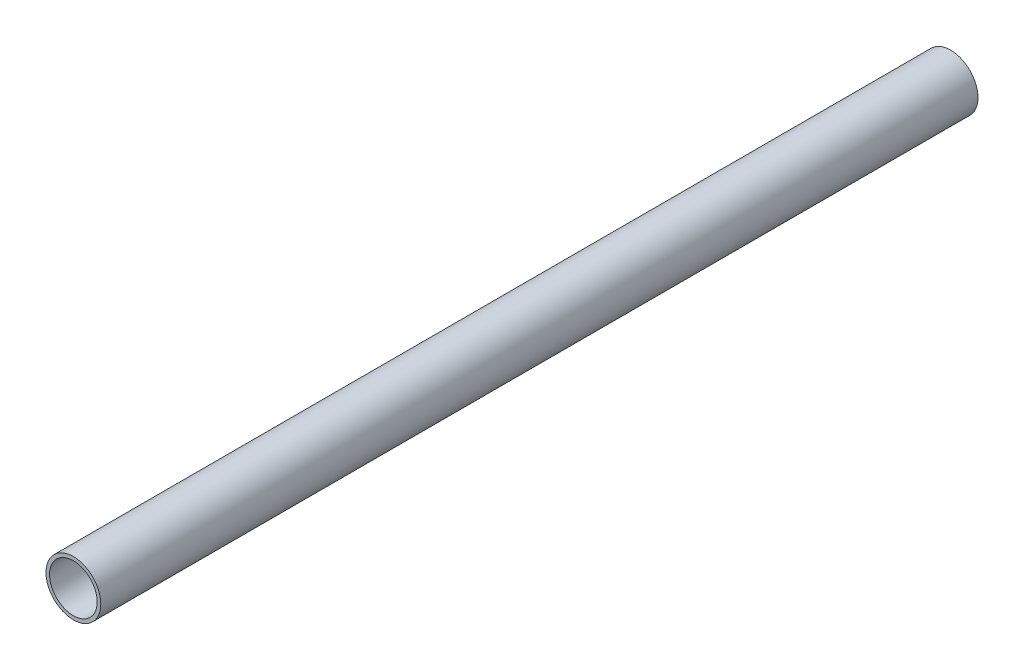
ISO-10303-21;
HEADER;
FILE_DESCRIPTION(('STEP AP214'),'2;1');
FILE_NAME('part.step','',(''),(''),'','','');
FILE_SCHEMA(('AUTOMOTIVE_DESIGN { 1 0 10303 214 1 1 1 1 }'));
ENDSEC;
DATA;
#1=APPLICATION_CONTEXT('core data for automotive mechanical design processes');
#2=APPLICATION_PROTOCOL_DEFINITION('international standard','automotive_design',2000,#1);
#3=PRODUCT_CONTEXT('',#1,'mechanical');
#4=PRODUCT('Part','Part','',(#3));
#5=PRODUCT_RELATED_PRODUCT_CATEGORY('part','',(#4));
#6=PRODUCT_DEFINITION_FORMATION('','',#4);
#7=PRODUCT_DEFINITION_CONTEXT('part definition',#1,'design');
#8=PRODUCT_DEFINITION('design','',#6,#7);
#9=PRODUCT_DEFINITION_SHAPE('','',#8);
#10=(LENGTH_UNIT() NAMED_UNIT(*) SI_UNIT(.MILLI.,.METRE.));
#11=(NAMED_UNIT(*) PLANE_ANGLE_UNIT() SI_UNIT($,.RADIAN.));
#12=(NAMED_UNIT(*) SI_UNIT($,.STERADIAN.) SOLID_ANGLE_UNIT());
#13=UNCERTAINTY_MEASURE_WITH_UNIT(LENGTH_MEASURE(1.E-05),#10,'distance_accuracy_value','');
#14=(GEOMETRIC_REPRESENTATION_CONTEXT(3) GLOBAL_UNCERTAINTY_ASSIGNED_CONTEXT((#13)) GLOBAL_UNIT_ASSIGNED_CONTEXT((#10,
#11,#12)) REPRESENTATION_CONTEXT('',''));
#15=CARTESIAN_POINT('',(0.,0.,0.));
#16=DIRECTION('',(0.,0.,1.));
#17=DIRECTION('',(1.,0.,0.));
#18=AXIS2_PLACEMENT_3D('',#15,#16,#17);
#19=CARTESIAN_POINT('',(0.,0.,152.4));
#20=DIRECTION('',(0.,0.,1.));
#21=DIRECTION('',(1.,0.,0.));
#22=AXIS2_PLACEMENT_3D('',#19,#20,#21);
#23=PLANE('',#22);
#24=CARTESIAN_POINT('',(0.,0.,152.4));
#25=DIRECTION('',(0.,0.,1.));
#26=DIRECTION('',(1.,0.,0.));
#27=AXIS2_PLACEMENT_3D('',#24,#25,#26);
#28=CIRCLE('',#27,9.525);
#29=CARTESIAN_POINT('',(9.525,0.,152.4));
#30=VERTEX_POINT('',#29);
#31=EDGE_CURVE('E10',#30,#30,#28,.T.);
#32=ORIENTED_EDGE('',*,*,#31,.T.);
#33=EDGE_LOOP('',(#32));
#34=FACE_BOUND('',#33,.T.);
#35=CARTESIAN_POINT('',(0.,0.,152.4));
#36=DIRECTION('',(0.,0.,1.));
#37=DIRECTION('',(1.,0.,0.));
#38=AXIS2_PLACEMENT_3D('',#35,#36,#37);
#39=CIRCLE('',#38,8.2804);
#40=CARTESIAN_POINT('',(8.2804,0.,152.4));
#41=VERTEX_POINT('',#40);
#42=EDGE_CURVE('E37',#41,#41,#39,.T.);
#43=ORIENTED_EDGE('',*,*,#42,.F.);
#44=EDGE_LOOP('',(#43));
#45=FACE_BOUND('',#44,.T.);
#46=ADVANCED_FACE('F30',(#34,#45),#23,.T.);
#47=CARTESIAN_POINT('',(0.,0.,152.4));
#48=DIRECTION('',(0.,0.,-1.));
#49=DIRECTION('',(-1.,0.,0.));
#50=AXIS2_PLACEMENT_3D('',#47,#48,#49);
#51=CYLINDRICAL_SURFACE('',#50,9.525);
#52=ORIENTED_EDGE('',*,*,#31,.F.);
#53=EDGE_LOOP('',(#52));
#54=FACE_BOUND('',#53,.T.);
#55=CARTESIAN_POINT('',(0.,0.,-152.4));
#56=DIRECTION('',(0.,0.,1.));
#57=DIRECTION('',(1.,0.,0.));
#58=AXIS2_PLACEMENT_3D('',#55,#56,#57);
#59=CIRCLE('',#58,9.525);
#60=CARTESIAN_POINT('',(9.525,0.,-152.4));
#61=VERTEX_POINT('',#60);
#62=EDGE_CURVE('E41',#61,#61,#59,.T.);
#63=ORIENTED_EDGE('',*,*,#62,.T.);
#64=EDGE_LOOP('',(#63));
#65=FACE_BOUND('',#64,.T.);
#66=ADVANCED_FACE('F32',(#54,#65),#51,.T.);
#67=CARTESIAN_POINT('',(0.,0.,152.4));
#68=DIRECTION('',(0.,0.,-1.));
#69=DIRECTION('',(-1.,0.,0.));
#70=AXIS2_PLACEMENT_3D('',#67,#68,#69);
#71=CYLINDRICAL_SURFACE('',#70,8.2804);
#72=ORIENTED_EDGE('',*,*,#42,.T.);
#73=EDGE_LOOP('',(#72));
#74=FACE_BOUND('',#73,.T.);
#75=CARTESIAN_POINT('',(0.,0.,-152.4));
#76=DIRECTION('',(0.,0.,1.));
#77=DIRECTION('',(1.,0.,0.));
#78=AXIS2_PLACEMENT_3D('',#75,#76,#77);
#79=CIRCLE('',#78,8.2804);
#80=CARTESIAN_POINT('',(8.2804,0.,-152.4));
#81=VERTEX_POINT('',#80);
#82=EDGE_CURVE('E45',#81,#81,#79,.T.);
#83=ORIENTED_EDGE('',*,*,#82,.F.);
#84=EDGE_LOOP('',(#83));
#85=FACE_BOUND('',#84,.T.);
#86=ADVANCED_FACE('F54',(#74,#85),#71,.F.);
#87=CARTESIAN_POINT('',(0.,0.,-152.4));
#88=DIRECTION('',(0.,0.,1.));
#89=DIRECTION('',(1.,0.,0.));
#90=AXIS2_PLACEMENT_3D('',#87,#88,#89);
#91=PLANE('',#90);
#92=ORIENTED_EDGE('',*,*,#82,.T.);
#93=EDGE_LOOP('',(#92));
#94=FACE_BOUND('',#93,.T.);
#95=ORIENTED_EDGE('',*,*,#62,.F.);
#96=EDGE_LOOP('',(#95));
#97=FACE_BOUND('',#96,.T.);
#98=ADVANCED_FACE('F51',(#94,#97),#91,.F.);
#99=CLOSED_SHELL('',(#46,#66,#86,#98));
#100=MANIFOLD_SOLID_BREP('B2',#99);
#101=ADVANCED_BREP_SHAPE_REPRESENTATION('',(#18,#100),#14);
#102=SHAPE_DEFINITION_REPRESENTATION(#9,#101);
ENDSEC;
END-ISO-10303-21;
